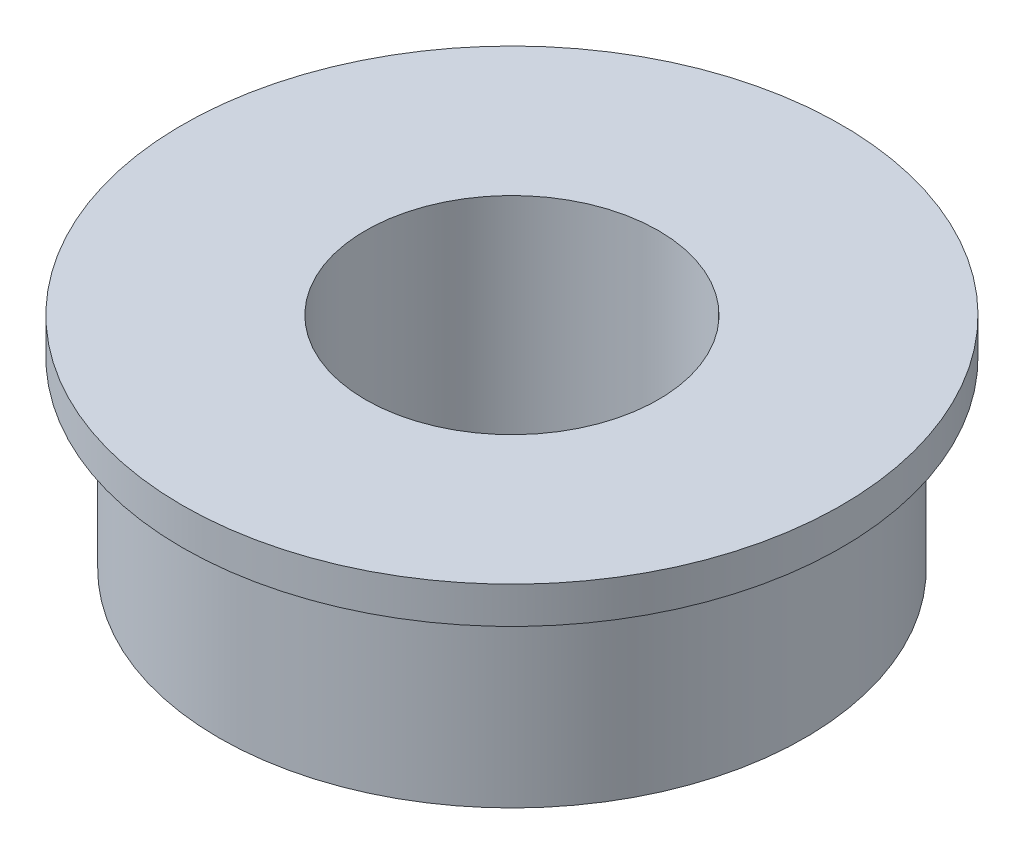
ISO-10303-21;
HEADER;
FILE_DESCRIPTION(('STEP AP214'),'2;1');
FILE_NAME('part.step','',(''),(''),'','','');
FILE_SCHEMA(('AUTOMOTIVE_DESIGN { 1 0 10303 214 1 1 1 1 }'));
ENDSEC;
DATA;
#1=APPLICATION_CONTEXT('core data for automotive mechanical design processes');
#2=APPLICATION_PROTOCOL_DEFINITION('international standard','automotive_design',2000,#1);
#3=PRODUCT_CONTEXT('',#1,'mechanical');
#4=PRODUCT('Part','Part','',(#3));
#5=PRODUCT_RELATED_PRODUCT_CATEGORY('part','',(#4));
#6=PRODUCT_DEFINITION_FORMATION('','',#4);
#7=PRODUCT_DEFINITION_CONTEXT('part definition',#1,'design');
#8=PRODUCT_DEFINITION('design','',#6,#7);
#9=PRODUCT_DEFINITION_SHAPE('','',#8);
#10=(LENGTH_UNIT() NAMED_UNIT(*) SI_UNIT(.MILLI.,.METRE.));
#11=(NAMED_UNIT(*) PLANE_ANGLE_UNIT() SI_UNIT($,.RADIAN.));
#12=(NAMED_UNIT(*) SI_UNIT($,.STERADIAN.) SOLID_ANGLE_UNIT());
#13=UNCERTAINTY_MEASURE_WITH_UNIT(LENGTH_MEASURE(1.E-05),#10,'distance_accuracy_value','');
#14=(GEOMETRIC_REPRESENTATION_CONTEXT(3) GLOBAL_UNCERTAINTY_ASSIGNED_CONTEXT((#13)) GLOBAL_UNIT_ASSIGNED_CONTEXT((#10,
#11,#12)) REPRESENTATION_CONTEXT('',''));
#15=CARTESIAN_POINT('',(0.,0.,0.));
#16=DIRECTION('',(0.,0.,1.));
#17=DIRECTION('',(1.,0.,0.));
#18=AXIS2_PLACEMENT_3D('',#15,#16,#17);
#19=CARTESIAN_POINT('',(0.,3.,0.));
#20=DIRECTION('',(0.,-1.,0.));
#21=DIRECTION('',(0.,0.,-1.));
#22=AXIS2_PLACEMENT_3D('',#19,#20,#21);
#23=CYLINDRICAL_SURFACE('',#22,4.);
#24=CARTESIAN_POINT('',(0.,0.,0.));
#25=DIRECTION('',(0.,1.,0.));
#26=DIRECTION('',(0.,0.,1.));
#27=AXIS2_PLACEMENT_3D('',#24,#25,#26);
#28=CIRCLE('',#27,4.);
#29=CARTESIAN_POINT('',(0.,0.,4.));
#30=VERTEX_POINT('',#29);
#31=EDGE_CURVE('E37',#30,#30,#28,.T.);
#32=ORIENTED_EDGE('',*,*,#31,.T.);
#33=EDGE_LOOP('',(#32));
#34=FACE_BOUND('',#33,.T.);
#35=CARTESIAN_POINT('',(0.,2.5,0.));
#36=DIRECTION('',(0.,1.,0.));
#37=DIRECTION('',(0.,0.,1.));
#38=AXIS2_PLACEMENT_3D('',#35,#36,#37);
#39=CIRCLE('',#38,4.);
#40=CARTESIAN_POINT('',(0.,2.5,4.));
#41=VERTEX_POINT('',#40);
#42=EDGE_CURVE('E10',#41,#41,#39,.T.);
#43=ORIENTED_EDGE('',*,*,#42,.F.);
#44=EDGE_LOOP('',(#43));
#45=FACE_BOUND('',#44,.T.);
#46=ADVANCED_FACE('F34',(#34,#45),#23,.T.);
#47=CARTESIAN_POINT('',(0.,3.,0.));
#48=DIRECTION('',(0.,1.,0.));
#49=DIRECTION('',(0.,0.,1.));
#50=AXIS2_PLACEMENT_3D('',#47,#48,#49);
#51=PLANE('',#50);
#52=CARTESIAN_POINT('',(0.,3.,0.));
#53=DIRECTION('',(0.,1.,0.));
#54=DIRECTION('',(0.,0.,1.));
#55=AXIS2_PLACEMENT_3D('',#52,#53,#54);
#56=CIRCLE('',#55,2.);
#57=CARTESIAN_POINT('',(0.,3.,2.));
#58=VERTEX_POINT('',#57);
#59=EDGE_CURVE('E45',#58,#58,#56,.T.);
#60=ORIENTED_EDGE('',*,*,#59,.F.);
#61=EDGE_LOOP('',(#60));
#62=FACE_BOUND('',#61,.T.);
#63=CARTESIAN_POINT('',(0.,3.,0.));
#64=DIRECTION('',(0.,1.,0.));
#65=DIRECTION('',(0.,0.,1.));
#66=AXIS2_PLACEMENT_3D('',#63,#64,#65);
#67=CIRCLE('',#66,4.5);
#68=CARTESIAN_POINT('',(0.,3.,4.5));
#69=VERTEX_POINT('',#68);
#70=EDGE_CURVE('E48',#69,#69,#67,.T.);
#71=ORIENTED_EDGE('',*,*,#70,.T.);
#72=EDGE_LOOP('',(#71));
#73=FACE_BOUND('',#72,.T.);
#74=ADVANCED_FACE('F62',(#62,#73),#51,.T.);
#75=CARTESIAN_POINT('',(0.,0.,0.));
#76=DIRECTION('',(0.,1.,0.));
#77=DIRECTION('',(0.,0.,1.));
#78=AXIS2_PLACEMENT_3D('',#75,#76,#77);
#79=PLANE('',#78);
#80=ORIENTED_EDGE('',*,*,#31,.F.);
#81=EDGE_LOOP('',(#80));
#82=FACE_BOUND('',#81,.T.);
#83=CARTESIAN_POINT('',(0.,0.,0.));
#84=DIRECTION('',(0.,1.,0.));
#85=DIRECTION('',(0.,0.,1.));
#86=AXIS2_PLACEMENT_3D('',#83,#84,#85);
#87=CIRCLE('',#86,2.);
#88=CARTESIAN_POINT('',(0.,0.,2.));
#89=VERTEX_POINT('',#88);
#90=EDGE_CURVE('E51',#89,#89,#87,.T.);
#91=ORIENTED_EDGE('',*,*,#90,.T.);
#92=EDGE_LOOP('',(#91));
#93=FACE_BOUND('',#92,.T.);
#94=ADVANCED_FACE('F80',(#82,#93),#79,.F.);
#95=CARTESIAN_POINT('',(0.,3.,0.));
#96=DIRECTION('',(0.,-1.,0.));
#97=DIRECTION('',(0.,0.,-1.));
#98=AXIS2_PLACEMENT_3D('',#95,#96,#97);
#99=CYLINDRICAL_SURFACE('',#98,2.);
#100=ORIENTED_EDGE('',*,*,#59,.T.);
#101=EDGE_LOOP('',(#100));
#102=FACE_BOUND('',#101,.T.);
#103=ORIENTED_EDGE('',*,*,#90,.F.);
#104=EDGE_LOOP('',(#103));
#105=FACE_BOUND('',#104,.T.);
#106=ADVANCED_FACE('F71',(#102,#105),#99,.F.);
#107=CARTESIAN_POINT('',(0.,2.5,0.));
#108=DIRECTION('',(0.,1.,0.));
#109=DIRECTION('',(0.,0.,1.));
#110=AXIS2_PLACEMENT_3D('',#107,#108,#109);
#111=PLANE('',#110);
#112=CARTESIAN_POINT('',(0.,2.5,0.));
#113=DIRECTION('',(0.,1.,0.));
#114=DIRECTION('',(0.,0.,1.));
#115=AXIS2_PLACEMENT_3D('',#112,#113,#114);
#116=CIRCLE('',#115,4.5);
#117=CARTESIAN_POINT('',(0.,2.5,4.5));
#118=VERTEX_POINT('',#117);
#119=EDGE_CURVE('E53',#118,#118,#116,.T.);
#120=ORIENTED_EDGE('',*,*,#119,.F.);
#121=EDGE_LOOP('',(#120));
#122=FACE_BOUND('',#121,.T.);
#123=ORIENTED_EDGE('',*,*,#42,.T.);
#124=EDGE_LOOP('',(#123));
#125=FACE_BOUND('',#124,.T.);
#126=ADVANCED_FACE('F66',(#122,#125),#111,.F.);
#127=CARTESIAN_POINT('',(0.,2.5,0.));
#128=DIRECTION('',(0.,1.,0.));
#129=DIRECTION('',(0.,0.,1.));
#130=AXIS2_PLACEMENT_3D('',#127,#128,#129);
#131=CYLINDRICAL_SURFACE('',#130,4.5);
#132=ORIENTED_EDGE('',*,*,#119,.T.);
#133=EDGE_LOOP('',(#132));
#134=FACE_BOUND('',#133,.T.);
#135=ORIENTED_EDGE('',*,*,#70,.F.);
#136=EDGE_LOOP('',(#135));
#137=FACE_BOUND('',#136,.T.);
#138=ADVANCED_FACE('F64',(#134,#137),#131,.T.);
#139=CLOSED_SHELL('',(#46,#74,#94,#106,#126,#138));
#140=MANIFOLD_SOLID_BREP('B2',#139);
#141=ADVANCED_BREP_SHAPE_REPRESENTATION('',(#18,#140),#14);
#142=SHAPE_DEFINITION_REPRESENTATION(#9,#141);
ENDSEC;
END-ISO-10303-21;
